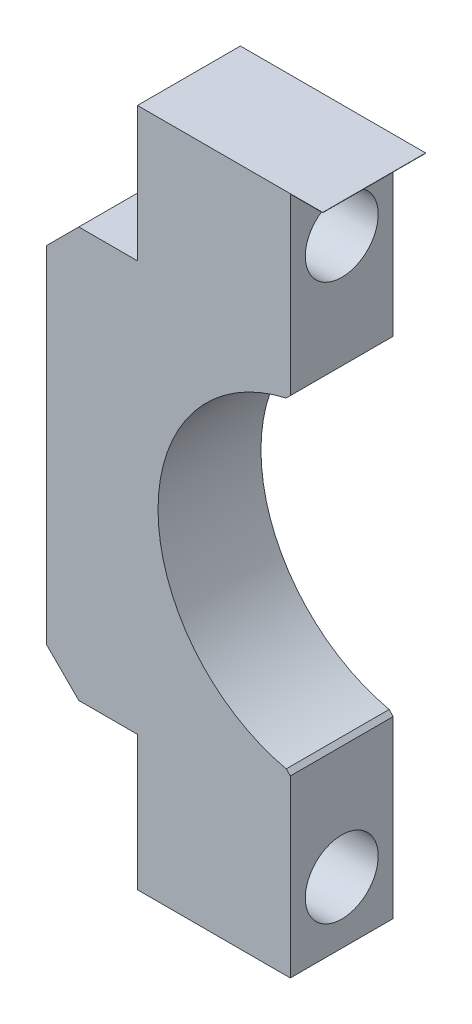
ISO-10303-21;
HEADER;
FILE_DESCRIPTION(('STEP AP214'),'2;1');
FILE_NAME('part.step','',(''),(''),'','','');
FILE_SCHEMA(('AUTOMOTIVE_DESIGN { 1 0 10303 214 1 1 1 1 }'));
ENDSEC;
DATA;
#1=APPLICATION_CONTEXT('core data for automotive mechanical design processes');
#2=APPLICATION_PROTOCOL_DEFINITION('international standard','automotive_design',2000,#1);
#3=PRODUCT_CONTEXT('',#1,'mechanical');
#4=PRODUCT('Part','Part','',(#3));
#5=PRODUCT_RELATED_PRODUCT_CATEGORY('part','',(#4));
#6=PRODUCT_DEFINITION_FORMATION('','',#4);
#7=PRODUCT_DEFINITION_CONTEXT('part definition',#1,'design');
#8=PRODUCT_DEFINITION('design','',#6,#7);
#9=PRODUCT_DEFINITION_SHAPE('','',#8);
#10=(LENGTH_UNIT() NAMED_UNIT(*) SI_UNIT(.MILLI.,.METRE.));
#11=(NAMED_UNIT(*) PLANE_ANGLE_UNIT() SI_UNIT($,.RADIAN.));
#12=(NAMED_UNIT(*) SI_UNIT($,.STERADIAN.) SOLID_ANGLE_UNIT());
#13=UNCERTAINTY_MEASURE_WITH_UNIT(LENGTH_MEASURE(1.E-05),#10,'distance_accuracy_value','');
#14=(GEOMETRIC_REPRESENTATION_CONTEXT(3) GLOBAL_UNCERTAINTY_ASSIGNED_CONTEXT((#13)) GLOBAL_UNIT_ASSIGNED_CONTEXT((#10,
#11,#12)) REPRESENTATION_CONTEXT('',''));
#15=CARTESIAN_POINT('',(0.,0.,0.));
#16=DIRECTION('',(0.,0.,1.));
#17=DIRECTION('',(1.,0.,0.));
#18=AXIS2_PLACEMENT_3D('',#15,#16,#17);
#19=CARTESIAN_POINT('',(0.,0.,3.175));
#20=DIRECTION('',(0.,0.,-1.));
#21=DIRECTION('',(-1.,0.,0.));
#22=AXIS2_PLACEMENT_3D('',#19,#20,#21);
#23=CYLINDRICAL_SURFACE('',#22,10.16);
#24=CARTESIAN_POINT('',(0.,0.,3.175));
#25=DIRECTION('',(0.,0.,-1.));
#26=DIRECTION('',(1.,0.,0.));
#27=AXIS2_PLACEMENT_3D('',#24,#25,#26);
#28=CIRCLE('',#27,10.16);
#29=CARTESIAN_POINT('',(-2.25293846404319,-9.9070615359568,3.175));
#30=VERTEX_POINT('',#29);
#31=CARTESIAN_POINT('',(-2.25293846404321,9.90706153595679,3.175));
#32=VERTEX_POINT('',#31);
#33=EDGE_CURVE('E202',#30,#32,#28,.T.);
#34=ORIENTED_EDGE('',*,*,#33,.F.);
#35=DIRECTION('',(0.,0.,-1.));
#36=VECTOR('',#35,1.);
#37=CARTESIAN_POINT('',(-2.25293846404319,-9.9070615359568,3.175));
#38=LINE('',#37,#36);
#39=CARTESIAN_POINT('',(-2.25293846404319,-9.9070615359568,-3.175));
#40=VERTEX_POINT('',#39);
#41=EDGE_CURVE('E242',#30,#40,#38,.T.);
#42=ORIENTED_EDGE('',*,*,#41,.T.);
#43=CARTESIAN_POINT('',(0.,0.,-3.175));
#44=DIRECTION('',(0.,0.,-1.));
#45=DIRECTION('',(1.,0.,0.));
#46=AXIS2_PLACEMENT_3D('',#43,#44,#45);
#47=CIRCLE('',#46,10.16);
#48=CARTESIAN_POINT('',(-2.25293846404321,9.90706153595679,-3.175));
#49=VERTEX_POINT('',#48);
#50=EDGE_CURVE('E179',#40,#49,#47,.T.);
#51=ORIENTED_EDGE('',*,*,#50,.T.);
#52=DIRECTION('',(0.,0.,-1.));
#53=VECTOR('',#52,1.);
#54=CARTESIAN_POINT('',(-2.25293846404321,9.90706153595679,3.175));
#55=LINE('',#54,#53);
#56=EDGE_CURVE('E236',#49,#32,#55,.F.);
#57=ORIENTED_EDGE('',*,*,#56,.T.);
#58=EDGE_LOOP('',(#34,#42,#51,#57));
#59=FACE_BOUND('',#58,.T.);
#60=ADVANCED_FACE('F41',(#59),#23,.F.);
#61=CARTESIAN_POINT('',(0.,10.16,3.175));
#62=DIRECTION('',(-1.,0.,0.));
#63=DIRECTION('',(0.,0.,1.));
#64=AXIS2_PLACEMENT_3D('',#61,#62,#63);
#65=PLANE('',#64);
#66=DIRECTION('',(0.,1.,0.));
#67=VECTOR('',#66,1.);
#68=CARTESIAN_POINT('',(0.,10.16,3.175));
#69=LINE('',#68,#67);
#70=CARTESIAN_POINT('',(0.,20.9361674577158,3.175));
#71=VERTEX_POINT('',#70);
#72=CARTESIAN_POINT('',(0.,20.955,3.175));
#73=VERTEX_POINT('',#72);
#74=EDGE_CURVE('E171',#71,#73,#69,.T.);
#75=ORIENTED_EDGE('',*,*,#74,.F.);
#76=DIRECTION('',(0.,0.,1.));
#77=VECTOR('',#76,1.);
#78=CARTESIAN_POINT('',(0.,20.9361674577158,-3.175));
#79=LINE('',#78,#77);
#80=CARTESIAN_POINT('',(0.,20.9361674577158,-3.175));
#81=VERTEX_POINT('',#80);
#82=EDGE_CURVE('E157',#81,#71,#79,.T.);
#83=ORIENTED_EDGE('',*,*,#82,.F.);
#84=DIRECTION('',(0.,1.,0.));
#85=VECTOR('',#84,1.);
#86=CARTESIAN_POINT('',(0.,10.16,-3.175));
#87=LINE('',#86,#85);
#88=CARTESIAN_POINT('',(0.,20.955,-3.175));
#89=VERTEX_POINT('',#88);
#90=EDGE_CURVE('E169',#81,#89,#87,.T.);
#91=ORIENTED_EDGE('',*,*,#90,.T.);
#92=DIRECTION('',(0.,0.,-1.));
#93=VECTOR('',#92,1.);
#94=CARTESIAN_POINT('',(0.,20.955,3.175));
#95=LINE('',#94,#93);
#96=EDGE_CURVE('E216',#73,#89,#95,.T.);
#97=ORIENTED_EDGE('',*,*,#96,.F.);
#98=EDGE_LOOP('',(#75,#83,#91,#97));
#99=FACE_BOUND('',#98,.T.);
#100=ADVANCED_FACE('F167',(#99),#65,.F.);
#101=CARTESIAN_POINT('',(0.,20.955,3.175));
#102=DIRECTION('',(0.,-1.,0.));
#103=DIRECTION('',(0.,0.,-1.));
#104=AXIS2_PLACEMENT_3D('',#101,#102,#103);
#105=PLANE('',#104);
#106=DIRECTION('',(-1.,0.,0.));
#107=VECTOR('',#106,1.);
#108=CARTESIAN_POINT('',(0.,20.955,-3.175));
#109=LINE('',#108,#107);
#110=CARTESIAN_POINT('',(-11.43,20.955,-3.175));
#111=VERTEX_POINT('',#110);
#112=EDGE_CURVE('E178',#89,#111,#109,.T.);
#113=ORIENTED_EDGE('',*,*,#112,.T.);
#114=DIRECTION('',(0.,0.,-1.));
#115=VECTOR('',#114,1.);
#116=CARTESIAN_POINT('',(-11.43,20.955,3.175));
#117=LINE('',#116,#115);
#118=CARTESIAN_POINT('',(-11.43,20.955,3.175));
#119=VERTEX_POINT('',#118);
#120=EDGE_CURVE('E213',#119,#111,#117,.T.);
#121=ORIENTED_EDGE('',*,*,#120,.F.);
#122=DIRECTION('',(-1.,0.,0.));
#123=VECTOR('',#122,1.);
#124=CARTESIAN_POINT('',(0.,20.955,3.175));
#125=LINE('',#124,#123);
#126=EDGE_CURVE('E289',#73,#119,#125,.T.);
#127=ORIENTED_EDGE('',*,*,#126,.F.);
#128=ORIENTED_EDGE('',*,*,#96,.T.);
#129=EDGE_LOOP('',(#113,#121,#127,#128));
#130=FACE_BOUND('',#129,.T.);
#131=ADVANCED_FACE('F356',(#130),#105,.F.);
#132=CARTESIAN_POINT('',(-11.43,20.955,3.175));
#133=DIRECTION('',(1.,0.,0.));
#134=DIRECTION('',(0.,0.,-1.));
#135=AXIS2_PLACEMENT_3D('',#132,#133,#134);
#136=PLANE('',#135);
#137=CARTESIAN_POINT('',(-11.43,17.145,0.));
#138=DIRECTION('',(1.,0.,0.));
#139=DIRECTION('',(0.,0.,-1.));
#140=AXIS2_PLACEMENT_3D('',#137,#138,#139);
#141=CIRCLE('',#140,2.24999999999999);
#142=CARTESIAN_POINT('',(-11.43,17.145,-2.24999999999999));
#143=VERTEX_POINT('',#142);
#144=EDGE_CURVE('E237',#143,#143,#141,.T.);
#145=ORIENTED_EDGE('',*,*,#144,.T.);
#146=EDGE_LOOP('',(#145));
#147=FACE_BOUND('',#146,.T.);
#148=DIRECTION('',(0.,-1.,0.));
#149=VECTOR('',#148,1.);
#150=CARTESIAN_POINT('',(-11.43,20.955,-3.175));
#151=LINE('',#150,#149);
#152=CARTESIAN_POINT('',(-11.43,12.6513872757101,-3.175));
#153=VERTEX_POINT('',#152);
#154=EDGE_CURVE('E181',#111,#153,#151,.T.);
#155=ORIENTED_EDGE('',*,*,#154,.T.);
#156=DIRECTION('',(0.,0.,-1.));
#157=VECTOR('',#156,1.);
#158=CARTESIAN_POINT('',(-11.43,12.6513872757101,3.175));
#159=LINE('',#158,#157);
#160=CARTESIAN_POINT('',(-11.43,12.6513872757101,3.175));
#161=VERTEX_POINT('',#160);
#162=EDGE_CURVE('E210',#161,#153,#159,.T.);
#163=ORIENTED_EDGE('',*,*,#162,.F.);
#164=DIRECTION('',(0.,-1.,0.));
#165=VECTOR('',#164,1.);
#166=CARTESIAN_POINT('',(-11.43,20.955,3.175));
#167=LINE('',#166,#165);
#168=EDGE_CURVE('E291',#119,#161,#167,.T.);
#169=ORIENTED_EDGE('',*,*,#168,.F.);
#170=ORIENTED_EDGE('',*,*,#120,.T.);
#171=EDGE_LOOP('',(#155,#163,#169,#170));
#172=FACE_BOUND('',#171,.T.);
#173=ADVANCED_FACE('F352',(#147,#172),#136,.F.);
#174=CARTESIAN_POINT('',(-11.43,12.6513872757101,3.175));
#175=DIRECTION('',(0.,-1.,0.));
#176=DIRECTION('',(0.,0.,-1.));
#177=AXIS2_PLACEMENT_3D('',#174,#175,#176);
#178=PLANE('',#177);
#179=DIRECTION('',(-1.,0.,0.));
#180=VECTOR('',#179,1.);
#181=CARTESIAN_POINT('',(-11.43,12.6513872757101,-3.175));
#182=LINE('',#181,#180);
#183=CARTESIAN_POINT('',(-15.05,12.6513872757101,-3.175));
#184=VERTEX_POINT('',#183);
#185=EDGE_CURVE('E189',#153,#184,#182,.T.);
#186=ORIENTED_EDGE('',*,*,#185,.T.);
#187=DIRECTION('',(0.,0.,1.));
#188=VECTOR('',#187,1.);
#189=CARTESIAN_POINT('',(-15.05,12.6513872757101,3.175));
#190=LINE('',#189,#188);
#191=CARTESIAN_POINT('',(-15.05,12.6513872757101,3.175));
#192=VERTEX_POINT('',#191);
#193=EDGE_CURVE('E234',#184,#192,#190,.T.);
#194=ORIENTED_EDGE('',*,*,#193,.T.);
#195=DIRECTION('',(-1.,0.,0.));
#196=VECTOR('',#195,1.);
#197=CARTESIAN_POINT('',(-11.43,12.6513872757101,3.175));
#198=LINE('',#197,#196);
#199=EDGE_CURVE('E293',#161,#192,#198,.T.);
#200=ORIENTED_EDGE('',*,*,#199,.F.);
#201=ORIENTED_EDGE('',*,*,#162,.T.);
#202=EDGE_LOOP('',(#186,#194,#200,#201));
#203=FACE_BOUND('',#202,.T.);
#204=ADVANCED_FACE('F348',(#203),#178,.F.);
#205=CARTESIAN_POINT('',(-17.05,12.6513872757101,3.175));
#206=DIRECTION('',(1.,0.,0.));
#207=DIRECTION('',(0.,1.,0.));
#208=AXIS2_PLACEMENT_3D('',#205,#206,#207);
#209=PLANE('',#208);
#210=DIRECTION('',(0.,-1.,0.));
#211=VECTOR('',#210,1.);
#212=CARTESIAN_POINT('',(-17.05,12.6513872757101,-3.175));
#213=LINE('',#212,#211);
#214=CARTESIAN_POINT('',(-17.05,10.6513872757101,-3.175));
#215=VERTEX_POINT('',#214);
#216=CARTESIAN_POINT('',(-17.05,-10.6513872757101,-3.175));
#217=VERTEX_POINT('',#216);
#218=EDGE_CURVE('E192',#215,#217,#213,.T.);
#219=ORIENTED_EDGE('',*,*,#218,.T.);
#220=DIRECTION('',(0.,0.,1.));
#221=VECTOR('',#220,1.);
#222=CARTESIAN_POINT('',(-17.05,-10.6513872757101,3.175));
#223=LINE('',#222,#221);
#224=CARTESIAN_POINT('',(-17.05,-10.6513872757101,3.175));
#225=VERTEX_POINT('',#224);
#226=EDGE_CURVE('E228',#217,#225,#223,.T.);
#227=ORIENTED_EDGE('',*,*,#226,.T.);
#228=DIRECTION('',(0.,-1.,0.));
#229=VECTOR('',#228,1.);
#230=CARTESIAN_POINT('',(-17.05,12.6513872757101,3.175));
#231=LINE('',#230,#229);
#232=CARTESIAN_POINT('',(-17.05,10.6513872757101,3.175));
#233=VERTEX_POINT('',#232);
#234=EDGE_CURVE('E296',#233,#225,#231,.T.);
#235=ORIENTED_EDGE('',*,*,#234,.F.);
#236=DIRECTION('',(0.,0.,-1.));
#237=VECTOR('',#236,1.);
#238=CARTESIAN_POINT('',(-17.05,10.6513872757101,3.175));
#239=LINE('',#238,#237);
#240=EDGE_CURVE('E225',#233,#215,#239,.T.);
#241=ORIENTED_EDGE('',*,*,#240,.T.);
#242=EDGE_LOOP('',(#219,#227,#235,#241));
#243=FACE_BOUND('',#242,.T.);
#244=ADVANCED_FACE('F340',(#243),#209,.F.);
#245=CARTESIAN_POINT('',(-17.05,-12.6513872757101,3.175));
#246=DIRECTION('',(0.,1.,0.));
#247=DIRECTION('',(0.,0.,1.));
#248=AXIS2_PLACEMENT_3D('',#245,#246,#247);
#249=PLANE('',#248);
#250=DIRECTION('',(1.,0.,0.));
#251=VECTOR('',#250,1.);
#252=CARTESIAN_POINT('',(-17.05,-12.6513872757101,3.175));
#253=LINE('',#252,#251);
#254=CARTESIAN_POINT('',(-15.05,-12.6513872757101,3.175));
#255=VERTEX_POINT('',#254);
#256=CARTESIAN_POINT('',(-11.43,-12.6513872757101,3.175));
#257=VERTEX_POINT('',#256);
#258=EDGE_CURVE('E299',#255,#257,#253,.T.);
#259=ORIENTED_EDGE('',*,*,#258,.F.);
#260=DIRECTION('',(0.,0.,-1.));
#261=VECTOR('',#260,1.);
#262=CARTESIAN_POINT('',(-15.05,-12.6513872757101,3.175));
#263=LINE('',#262,#261);
#264=CARTESIAN_POINT('',(-15.05,-12.6513872757101,-3.175));
#265=VERTEX_POINT('',#264);
#266=EDGE_CURVE('E218',#255,#265,#263,.T.);
#267=ORIENTED_EDGE('',*,*,#266,.T.);
#268=DIRECTION('',(1.,0.,0.));
#269=VECTOR('',#268,1.);
#270=CARTESIAN_POINT('',(-17.05,-12.6513872757101,-3.175));
#271=LINE('',#270,#269);
#272=CARTESIAN_POINT('',(-11.43,-12.6513872757101,-3.175));
#273=VERTEX_POINT('',#272);
#274=EDGE_CURVE('E195',#265,#273,#271,.T.);
#275=ORIENTED_EDGE('',*,*,#274,.T.);
#276=DIRECTION('',(0.,0.,-1.));
#277=VECTOR('',#276,1.);
#278=CARTESIAN_POINT('',(-11.43,-12.6513872757101,3.175));
#279=LINE('',#278,#277);
#280=EDGE_CURVE('E206',#257,#273,#279,.T.);
#281=ORIENTED_EDGE('',*,*,#280,.F.);
#282=EDGE_LOOP('',(#259,#267,#275,#281));
#283=FACE_BOUND('',#282,.T.);
#284=ADVANCED_FACE('F325',(#283),#249,.F.);
#285=CARTESIAN_POINT('',(-11.43,-20.955,3.175));
#286=DIRECTION('',(1.,0.,0.));
#287=DIRECTION('',(0.,1.,0.));
#288=AXIS2_PLACEMENT_3D('',#285,#286,#287);
#289=PLANE('',#288);
#290=CARTESIAN_POINT('',(-11.43,-17.145,0.));
#291=DIRECTION('',(1.,0.,0.));
#292=DIRECTION('',(0.,1.,0.));
#293=AXIS2_PLACEMENT_3D('',#290,#291,#292);
#294=CIRCLE('',#293,2.24999999999999);
#295=CARTESIAN_POINT('',(-11.43,-14.895,0.));
#296=VERTEX_POINT('',#295);
#297=EDGE_CURVE('E184',#296,#296,#294,.T.);
#298=ORIENTED_EDGE('',*,*,#297,.T.);
#299=EDGE_LOOP('',(#298));
#300=FACE_BOUND('',#299,.T.);
#301=DIRECTION('',(0.,-1.,0.));
#302=VECTOR('',#301,1.);
#303=CARTESIAN_POINT('',(-11.43,-20.955,-3.175));
#304=LINE('',#303,#302);
#305=CARTESIAN_POINT('',(-11.43,-20.955,-3.175));
#306=VERTEX_POINT('',#305);
#307=EDGE_CURVE('E197',#273,#306,#304,.T.);
#308=ORIENTED_EDGE('',*,*,#307,.T.);
#309=DIRECTION('',(0.,0.,-1.));
#310=VECTOR('',#309,1.);
#311=CARTESIAN_POINT('',(-11.43,-20.955,3.175));
#312=LINE('',#311,#310);
#313=CARTESIAN_POINT('',(-11.43,-20.955,3.175));
#314=VERTEX_POINT('',#313);
#315=EDGE_CURVE('E203',#314,#306,#312,.T.);
#316=ORIENTED_EDGE('',*,*,#315,.F.);
#317=DIRECTION('',(0.,-1.,0.));
#318=VECTOR('',#317,1.);
#319=CARTESIAN_POINT('',(-11.43,-20.955,3.175));
#320=LINE('',#319,#318);
#321=EDGE_CURVE('E301',#257,#314,#320,.T.);
#322=ORIENTED_EDGE('',*,*,#321,.F.);
#323=ORIENTED_EDGE('',*,*,#280,.T.);
#324=EDGE_LOOP('',(#308,#316,#322,#323));
#325=FACE_BOUND('',#324,.T.);
#326=ADVANCED_FACE('F322',(#300,#325),#289,.F.);
#327=CARTESIAN_POINT('',(0.,-20.955,3.175));
#328=DIRECTION('',(0.,1.,0.));
#329=DIRECTION('',(0.,0.,1.));
#330=AXIS2_PLACEMENT_3D('',#327,#328,#329);
#331=PLANE('',#330);
#332=DIRECTION('',(1.,0.,0.));
#333=VECTOR('',#332,1.);
#334=CARTESIAN_POINT('',(0.,-20.955,-3.175));
#335=LINE('',#334,#333);
#336=CARTESIAN_POINT('',(-2.00000000000002,-20.955,-3.175));
#337=VERTEX_POINT('',#336);
#338=EDGE_CURVE('E199',#306,#337,#335,.T.);
#339=ORIENTED_EDGE('',*,*,#338,.T.);
#340=DIRECTION('',(0.,0.,1.));
#341=VECTOR('',#340,1.);
#342=CARTESIAN_POINT('',(-2.00000000000002,-20.955,-3.175));
#343=LINE('',#342,#341);
#344=CARTESIAN_POINT('',(-2.00000000000002,-20.955,3.175));
#345=VERTEX_POINT('',#344);
#346=EDGE_CURVE('E276',#337,#345,#343,.T.);
#347=ORIENTED_EDGE('',*,*,#346,.T.);
#348=DIRECTION('',(1.,0.,0.));
#349=VECTOR('',#348,1.);
#350=CARTESIAN_POINT('',(0.,-20.955,3.175));
#351=LINE('',#350,#349);
#352=EDGE_CURVE('E207',#314,#345,#351,.T.);
#353=ORIENTED_EDGE('',*,*,#352,.F.);
#354=ORIENTED_EDGE('',*,*,#315,.T.);
#355=EDGE_LOOP('',(#339,#347,#353,#354));
#356=FACE_BOUND('',#355,.T.);
#357=ADVANCED_FACE('F306',(#356),#331,.F.);
#358=CARTESIAN_POINT('',(0.,0.,3.175));
#359=DIRECTION('',(0.,0.,1.));
#360=DIRECTION('',(1.,0.,0.));
#361=AXIS2_PLACEMENT_3D('',#358,#359,#360);
#362=PLANE('',#361);
#363=DIRECTION('',(0.,-1.,0.));
#364=VECTOR('',#363,1.);
#365=CARTESIAN_POINT('',(-2.00000000000002,20.9361674577158,3.175));
#366=LINE('',#365,#364);
#367=CARTESIAN_POINT('',(-2.00000000000002,-10.16,3.175));
#368=VERTEX_POINT('',#367);
#369=EDGE_CURVE('E259',#368,#345,#366,.T.);
#370=ORIENTED_EDGE('',*,*,#369,.F.);
#371=DIRECTION('',(0.707106781186547,-0.707106781186548,0.));
#372=VECTOR('',#371,1.);
#373=CARTESIAN_POINT('',(-6.08,-6.07999999999999,3.175));
#374=LINE('',#373,#372);
#375=EDGE_CURVE('E50',#368,#30,#374,.F.);
#376=ORIENTED_EDGE('',*,*,#375,.T.);
#377=ORIENTED_EDGE('',*,*,#33,.T.);
#378=DIRECTION('',(-0.707106781186549,-0.707106781186546,0.));
#379=VECTOR('',#378,1.);
#380=CARTESIAN_POINT('',(-6.08,6.08000000000002,3.175));
#381=LINE('',#380,#379);
#382=CARTESIAN_POINT('',(-2.00000000000002,10.16,3.175));
#383=VERTEX_POINT('',#382);
#384=EDGE_CURVE('E249',#32,#383,#381,.F.);
#385=ORIENTED_EDGE('',*,*,#384,.T.);
#386=CARTESIAN_POINT('',(-2.00000000000002,20.9361674577158,3.175));
#387=VERTEX_POINT('',#386);
#388=EDGE_CURVE('E64',#387,#383,#366,.T.);
#389=ORIENTED_EDGE('',*,*,#388,.F.);
#390=DIRECTION('',(-1.,0.,0.));
#391=VECTOR('',#390,1.);
#392=CARTESIAN_POINT('',(0.,20.9361674577158,3.175));
#393=LINE('',#392,#391);
#394=EDGE_CURVE('E271',#71,#387,#393,.T.);
#395=ORIENTED_EDGE('',*,*,#394,.F.);
#396=ORIENTED_EDGE('',*,*,#74,.T.);
#397=ORIENTED_EDGE('',*,*,#126,.T.);
#398=ORIENTED_EDGE('',*,*,#168,.T.);
#399=ORIENTED_EDGE('',*,*,#199,.T.);
#400=DIRECTION('',(0.70710678118655,0.707106781186545,0.));
#401=VECTOR('',#400,1.);
#402=CARTESIAN_POINT('',(-13.850693637855,13.8506936378551,3.175));
#403=LINE('',#402,#401);
#404=EDGE_CURVE('E230',#192,#233,#403,.F.);
#405=ORIENTED_EDGE('',*,*,#404,.T.);
#406=ORIENTED_EDGE('',*,*,#234,.T.);
#407=DIRECTION('',(-0.707106781186546,0.707106781186549,0.));
#408=VECTOR('',#407,1.);
#409=CARTESIAN_POINT('',(-13.8506936378551,-13.850693637855,3.175));
#410=LINE('',#409,#408);
#411=EDGE_CURVE('E232',#225,#255,#410,.F.);
#412=ORIENTED_EDGE('',*,*,#411,.T.);
#413=ORIENTED_EDGE('',*,*,#258,.T.);
#414=ORIENTED_EDGE('',*,*,#321,.T.);
#415=ORIENTED_EDGE('',*,*,#352,.T.);
#416=EDGE_LOOP('',(#370,#376,#377,#385,#389,#395,#396,#397,#398,#399,#405,#406,#412,#413,#414,#415));
#417=FACE_BOUND('',#416,.T.);
#418=ADVANCED_FACE('F256',(#417),#362,.T.);
#419=CARTESIAN_POINT('',(0.,0.,-3.175));
#420=DIRECTION('',(0.,0.,1.));
#421=DIRECTION('',(1.,0.,0.));
#422=AXIS2_PLACEMENT_3D('',#419,#420,#421);
#423=PLANE('',#422);
#424=DIRECTION('',(-0.707106781186547,0.707106781186548,0.));
#425=VECTOR('',#424,1.);
#426=CARTESIAN_POINT('',(-2.25293846404319,-9.9070615359568,-3.175));
#427=LINE('',#426,#425);
#428=CARTESIAN_POINT('',(-2.00000000000002,-10.16,-3.175));
#429=VERTEX_POINT('',#428);
#430=EDGE_CURVE('E247',#40,#429,#427,.F.);
#431=ORIENTED_EDGE('',*,*,#430,.T.);
#432=DIRECTION('',(0.,-1.,0.));
#433=VECTOR('',#432,1.);
#434=CARTESIAN_POINT('',(-2.00000000000002,20.9361674577158,-3.175));
#435=LINE('',#434,#433);
#436=EDGE_CURVE('E57',#429,#337,#435,.T.);
#437=ORIENTED_EDGE('',*,*,#436,.T.);
#438=ORIENTED_EDGE('',*,*,#338,.F.);
#439=ORIENTED_EDGE('',*,*,#307,.F.);
#440=ORIENTED_EDGE('',*,*,#274,.F.);
#441=DIRECTION('',(0.707106781186546,-0.707106781186549,0.));
#442=VECTOR('',#441,1.);
#443=CARTESIAN_POINT('',(-15.05,-12.6513872757101,-3.175));
#444=LINE('',#443,#442);
#445=EDGE_CURVE('E223',#265,#217,#444,.F.);
#446=ORIENTED_EDGE('',*,*,#445,.T.);
#447=ORIENTED_EDGE('',*,*,#218,.F.);
#448=DIRECTION('',(-0.70710678118655,-0.707106781186545,0.));
#449=VECTOR('',#448,1.);
#450=CARTESIAN_POINT('',(-17.05,10.6513872757101,-3.175));
#451=LINE('',#450,#449);
#452=EDGE_CURVE('E221',#215,#184,#451,.F.);
#453=ORIENTED_EDGE('',*,*,#452,.T.);
#454=ORIENTED_EDGE('',*,*,#185,.F.);
#455=ORIENTED_EDGE('',*,*,#154,.F.);
#456=ORIENTED_EDGE('',*,*,#112,.F.);
#457=ORIENTED_EDGE('',*,*,#90,.F.);
#458=DIRECTION('',(-1.,0.,0.));
#459=VECTOR('',#458,1.);
#460=CARTESIAN_POINT('',(0.,20.9361674577158,-3.175));
#461=LINE('',#460,#459);
#462=CARTESIAN_POINT('',(-2.00000000000002,20.9361674577158,-3.175));
#463=VERTEX_POINT('',#462);
#464=EDGE_CURVE('E153',#81,#463,#461,.T.);
#465=ORIENTED_EDGE('',*,*,#464,.T.);
#466=CARTESIAN_POINT('',(-2.00000000000002,10.16,-3.175));
#467=VERTEX_POINT('',#466);
#468=EDGE_CURVE('E172',#463,#467,#435,.T.);
#469=ORIENTED_EDGE('',*,*,#468,.T.);
#470=DIRECTION('',(0.707106781186549,0.707106781186546,0.));
#471=VECTOR('',#470,1.);
#472=CARTESIAN_POINT('',(0.,12.16,-3.175));
#473=LINE('',#472,#471);
#474=EDGE_CURVE('E245',#467,#49,#473,.F.);
#475=ORIENTED_EDGE('',*,*,#474,.T.);
#476=ORIENTED_EDGE('',*,*,#50,.F.);
#477=EDGE_LOOP('',(#431,#437,#438,#439,#440,#446,#447,#453,#454,#455,#456,#457,#465,#469,#475,#476));
#478=FACE_BOUND('',#477,.T.);
#479=ADVANCED_FACE('F176',(#478),#423,.F.);
#480=CARTESIAN_POINT('',(-15.05,-12.6513872757101,3.175));
#481=DIRECTION('',(0.707106781186549,0.707106781186546,0.));
#482=DIRECTION('',(0.,0.,-1.));
#483=AXIS2_PLACEMENT_3D('',#480,#481,#482);
#484=PLANE('',#483);
#485=ORIENTED_EDGE('',*,*,#411,.F.);
#486=ORIENTED_EDGE('',*,*,#226,.F.);
#487=ORIENTED_EDGE('',*,*,#445,.F.);
#488=ORIENTED_EDGE('',*,*,#266,.F.);
#489=EDGE_LOOP('',(#485,#486,#487,#488));
#490=FACE_BOUND('',#489,.T.);
#491=ADVANCED_FACE('F336',(#490),#484,.F.);
#492=CARTESIAN_POINT('',(-17.05,10.6513872757101,3.175));
#493=DIRECTION('',(0.707106781186545,-0.70710678118655,0.));
#494=DIRECTION('',(0.,0.,-1.));
#495=AXIS2_PLACEMENT_3D('',#492,#493,#494);
#496=PLANE('',#495);
#497=ORIENTED_EDGE('',*,*,#404,.F.);
#498=ORIENTED_EDGE('',*,*,#193,.F.);
#499=ORIENTED_EDGE('',*,*,#452,.F.);
#500=ORIENTED_EDGE('',*,*,#240,.F.);
#501=EDGE_LOOP('',(#497,#498,#499,#500));
#502=FACE_BOUND('',#501,.T.);
#503=ADVANCED_FACE('F318',(#502),#496,.F.);
#504=CARTESIAN_POINT('',(-17.05,-17.145,0.));
#505=DIRECTION('',(-1.,0.,0.));
#506=DIRECTION('',(0.,0.,1.));
#507=AXIS2_PLACEMENT_3D('',#504,#505,#506);
#508=CYLINDRICAL_SURFACE('',#507,2.24999999999999);
#509=CARTESIAN_POINT('',(-2.00000000000002,-17.145,0.));
#510=DIRECTION('',(-1.,0.,0.));
#511=DIRECTION('',(0.,-1.,0.));
#512=AXIS2_PLACEMENT_3D('',#509,#510,#511);
#513=CIRCLE('',#512,2.24999999999999);
#514=CARTESIAN_POINT('',(-2.00000000000002,-19.395,0.));
#515=VERTEX_POINT('',#514);
#516=EDGE_CURVE('E240',#515,#515,#513,.F.);
#517=ORIENTED_EDGE('',*,*,#516,.T.);
#518=EDGE_LOOP('',(#517));
#519=FACE_BOUND('',#518,.T.);
#520=ORIENTED_EDGE('',*,*,#297,.F.);
#521=EDGE_LOOP('',(#520));
#522=FACE_BOUND('',#521,.T.);
#523=ADVANCED_FACE('F314',(#519,#522),#508,.F.);
#524=CARTESIAN_POINT('',(-17.05,17.145,0.));
#525=DIRECTION('',(-1.,0.,0.));
#526=DIRECTION('',(0.,0.,1.));
#527=AXIS2_PLACEMENT_3D('',#524,#525,#526);
#528=CYLINDRICAL_SURFACE('',#527,2.24999999999999);
#529=CARTESIAN_POINT('',(-2.00000000000002,17.145,0.));
#530=DIRECTION('',(-1.,0.,0.));
#531=DIRECTION('',(0.,-1.,0.));
#532=AXIS2_PLACEMENT_3D('',#529,#530,#531);
#533=CIRCLE('',#532,2.24999999999999);
#534=CARTESIAN_POINT('',(-2.00000000000002,14.895,0.));
#535=VERTEX_POINT('',#534);
#536=EDGE_CURVE('E281',#535,#535,#533,.F.);
#537=ORIENTED_EDGE('',*,*,#536,.T.);
#538=EDGE_LOOP('',(#537));
#539=FACE_BOUND('',#538,.T.);
#540=ORIENTED_EDGE('',*,*,#144,.F.);
#541=EDGE_LOOP('',(#540));
#542=FACE_BOUND('',#541,.T.);
#543=ADVANCED_FACE('F317',(#539,#542),#528,.F.);
#544=CARTESIAN_POINT('',(-2.25293846404319,-9.9070615359568,3.175));
#545=DIRECTION('',(-0.707106781186548,-0.707106781186547,0.));
#546=DIRECTION('',(0.,0.,-1.));
#547=AXIS2_PLACEMENT_3D('',#544,#545,#546);
#548=PLANE('',#547);
#549=DIRECTION('',(0.,0.,-1.));
#550=VECTOR('',#549,1.);
#551=CARTESIAN_POINT('',(-2.00000000000002,-10.16,3.175));
#552=LINE('',#551,#550);
#553=EDGE_CURVE('E267',#429,#368,#552,.F.);
#554=ORIENTED_EDGE('',*,*,#553,.F.);
#555=ORIENTED_EDGE('',*,*,#430,.F.);
#556=ORIENTED_EDGE('',*,*,#41,.F.);
#557=ORIENTED_EDGE('',*,*,#375,.F.);
#558=EDGE_LOOP('',(#554,#555,#556,#557));
#559=FACE_BOUND('',#558,.T.);
#560=ADVANCED_FACE('F266',(#559),#548,.F.);
#561=CARTESIAN_POINT('',(0.,12.16,3.175));
#562=DIRECTION('',(-0.707106781186546,0.707106781186549,0.));
#563=DIRECTION('',(0.,0.,-1.));
#564=AXIS2_PLACEMENT_3D('',#561,#562,#563);
#565=PLANE('',#564);
#566=DIRECTION('',(0.,0.,1.));
#567=VECTOR('',#566,1.);
#568=CARTESIAN_POINT('',(-2.00000000000002,10.16,3.175));
#569=LINE('',#568,#567);
#570=EDGE_CURVE('E11',#383,#467,#569,.F.);
#571=ORIENTED_EDGE('',*,*,#570,.F.);
#572=ORIENTED_EDGE('',*,*,#384,.F.);
#573=ORIENTED_EDGE('',*,*,#56,.F.);
#574=ORIENTED_EDGE('',*,*,#474,.F.);
#575=EDGE_LOOP('',(#571,#572,#573,#574));
#576=FACE_BOUND('',#575,.T.);
#577=ADVANCED_FACE('F44',(#576),#565,.F.);
#578=CARTESIAN_POINT('',(-2.00000000000002,20.9361674577158,-3.175));
#579=DIRECTION('',(-1.,0.,0.));
#580=DIRECTION('',(0.,-1.,0.));
#581=AXIS2_PLACEMENT_3D('',#578,#579,#580);
#582=PLANE('',#581);
#583=ORIENTED_EDGE('',*,*,#570,.T.);
#584=ORIENTED_EDGE('',*,*,#468,.F.);
#585=DIRECTION('',(0.,0.,1.));
#586=VECTOR('',#585,1.);
#587=CARTESIAN_POINT('',(-2.00000000000002,20.9361674577158,-3.175));
#588=LINE('',#587,#586);
#589=EDGE_CURVE('E159',#463,#387,#588,.T.);
#590=ORIENTED_EDGE('',*,*,#589,.T.);
#591=ORIENTED_EDGE('',*,*,#388,.T.);
#592=EDGE_LOOP('',(#583,#584,#590,#591));
#593=FACE_BOUND('',#592,.T.);
#594=ORIENTED_EDGE('',*,*,#536,.F.);
#595=EDGE_LOOP('',(#594));
#596=FACE_BOUND('',#595,.T.);
#597=ADVANCED_FACE('F311',(#593,#596),#582,.F.);
#598=CARTESIAN_POINT('',(0.,20.9361674577158,-3.175));
#599=DIRECTION('',(0.,1.,0.));
#600=DIRECTION('',(0.,0.,1.));
#601=AXIS2_PLACEMENT_3D('',#598,#599,#600);
#602=PLANE('',#601);
#603=ORIENTED_EDGE('',*,*,#394,.T.);
#604=ORIENTED_EDGE('',*,*,#589,.F.);
#605=ORIENTED_EDGE('',*,*,#464,.F.);
#606=ORIENTED_EDGE('',*,*,#82,.T.);
#607=EDGE_LOOP('',(#603,#604,#605,#606));
#608=FACE_BOUND('',#607,.T.);
#609=ADVANCED_FACE('F156',(#608),#602,.F.);
#610=ORIENTED_EDGE('',*,*,#553,.T.);
#611=ORIENTED_EDGE('',*,*,#369,.T.);
#612=ORIENTED_EDGE('',*,*,#346,.F.);
#613=ORIENTED_EDGE('',*,*,#436,.F.);
#614=EDGE_LOOP('',(#610,#611,#612,#613));
#615=FACE_BOUND('',#614,.T.);
#616=ORIENTED_EDGE('',*,*,#516,.F.);
#617=EDGE_LOOP('',(#616));
#618=FACE_BOUND('',#617,.T.);
#619=ADVANCED_FACE('F307',(#615,#618),#582,.F.);
#620=CLOSED_SHELL('',(#60,#100,#131,#173,#204,#244,#284,#326,#357,#418,#479,#491,#503,#523,#543,
#560,#577,#597,#609,#619));
#621=MANIFOLD_SOLID_BREP('B2',#620);
#622=ADVANCED_BREP_SHAPE_REPRESENTATION('',(#18,#621),#14);
#623=SHAPE_DEFINITION_REPRESENTATION(#9,#622);
ENDSEC;
END-ISO-10303-21;
